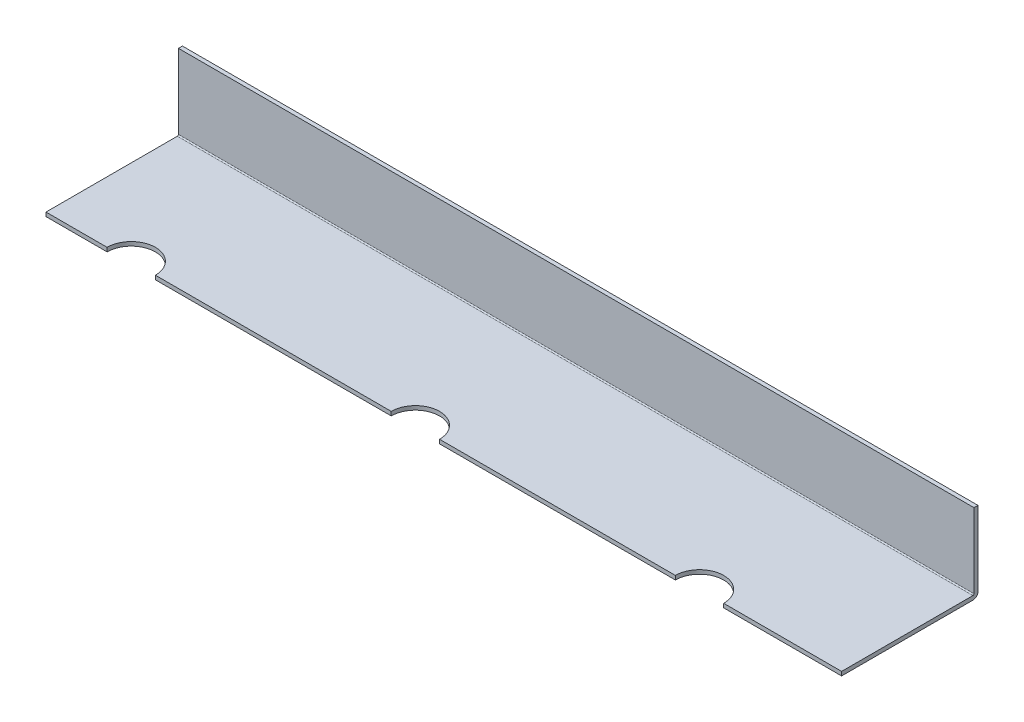
ISO-10303-21;
HEADER;
FILE_DESCRIPTION(('STEP AP214'),'2;1');
FILE_NAME('part.step','',(''),(''),'','','');
FILE_SCHEMA(('AUTOMOTIVE_DESIGN { 1 0 10303 214 1 1 1 1 }'));
ENDSEC;
DATA;
#1=APPLICATION_CONTEXT('core data for automotive mechanical design processes');
#2=APPLICATION_PROTOCOL_DEFINITION('international standard','automotive_design',2000,#1);
#3=PRODUCT_CONTEXT('',#1,'mechanical');
#4=PRODUCT('Part','Part','',(#3));
#5=PRODUCT_RELATED_PRODUCT_CATEGORY('part','',(#4));
#6=PRODUCT_DEFINITION_FORMATION('','',#4);
#7=PRODUCT_DEFINITION_CONTEXT('part definition',#1,'design');
#8=PRODUCT_DEFINITION('design','',#6,#7);
#9=PRODUCT_DEFINITION_SHAPE('','',#8);
#10=(LENGTH_UNIT() NAMED_UNIT(*) SI_UNIT(.MILLI.,.METRE.));
#11=(NAMED_UNIT(*) PLANE_ANGLE_UNIT() SI_UNIT($,.RADIAN.));
#12=(NAMED_UNIT(*) SI_UNIT($,.STERADIAN.) SOLID_ANGLE_UNIT());
#13=UNCERTAINTY_MEASURE_WITH_UNIT(LENGTH_MEASURE(1.E-05),#10,'distance_accuracy_value','');
#14=(GEOMETRIC_REPRESENTATION_CONTEXT(3) GLOBAL_UNCERTAINTY_ASSIGNED_CONTEXT((#13)) GLOBAL_UNIT_ASSIGNED_CONTEXT((#10,
#11,#12)) REPRESENTATION_CONTEXT('',''));
#15=CARTESIAN_POINT('',(0.,0.,0.));
#16=DIRECTION('',(0.,0.,1.));
#17=DIRECTION('',(1.,0.,0.));
#18=AXIS2_PLACEMENT_3D('',#15,#16,#17);
#19=CARTESIAN_POINT('',(-200.,13.31,-47.9999999999996));
#20=DIRECTION('',(0.,0.,-1.));
#21=DIRECTION('',(-1.,0.,0.));
#22=AXIS2_PLACEMENT_3D('',#19,#20,#21);
#23=PLANE('',#22);
#24=DIRECTION('',(-1.,0.,0.));
#25=VECTOR('',#24,1.);
#26=CARTESIAN_POINT('',(0.,-0.7,-47.9999999999996));
#27=LINE('',#26,#25);
#28=CARTESIAN_POINT('',(70.7499999999997,-0.7,-47.9999999999996));
#29=VERTEX_POINT('',#28);
#30=CARTESIAN_POINT('',(29.2499999999997,-0.7,-47.9999999999996));
#31=VERTEX_POINT('',#30);
#32=EDGE_CURVE('E258',#29,#31,#27,.T.);
#33=ORIENTED_EDGE('',*,*,#32,.F.);
#34=DIRECTION('',(0.,1.,0.));
#35=VECTOR('',#34,1.);
#36=CARTESIAN_POINT('',(70.7499999999997,-0.7,-47.9999999999996));
#37=LINE('',#36,#35);
#38=CARTESIAN_POINT('',(70.7499999999997,0.,-47.9999999999996));
#39=VERTEX_POINT('',#38);
#40=EDGE_CURVE('E227',#39,#29,#37,.F.);
#41=ORIENTED_EDGE('',*,*,#40,.F.);
#42=DIRECTION('',(-1.,0.,0.));
#43=VECTOR('',#42,1.);
#44=CARTESIAN_POINT('',(0.,0.,-47.9999999999996));
#45=LINE('',#44,#43);
#46=CARTESIAN_POINT('',(29.2499999999997,0.,-47.9999999999996));
#47=VERTEX_POINT('',#46);
#48=EDGE_CURVE('E255',#39,#47,#45,.T.);
#49=ORIENTED_EDGE('',*,*,#48,.T.);
#50=DIRECTION('',(0.,1.,0.));
#51=VECTOR('',#50,1.);
#52=CARTESIAN_POINT('',(29.2499999999997,-0.7,-47.9999999999996));
#53=LINE('',#52,#51);
#54=EDGE_CURVE('E216',#31,#47,#53,.T.);
#55=ORIENTED_EDGE('',*,*,#54,.F.);
#56=EDGE_LOOP('',(#33,#41,#49,#55));
#57=FACE_BOUND('',#56,.T.);
#58=ADVANCED_FACE('F36',(#57),#23,.F.);
#59=CARTESIAN_POINT('',(120.75,-0.7,-47.9999999999996));
#60=VERTEX_POINT('',#59);
#61=CARTESIAN_POINT('',(79.2499999999997,-0.7,-47.9999999999996));
#62=VERTEX_POINT('',#61);
#63=EDGE_CURVE('E200',#60,#62,#27,.T.);
#64=ORIENTED_EDGE('',*,*,#63,.F.);
#65=DIRECTION('',(0.,1.,0.));
#66=VECTOR('',#65,1.);
#67=CARTESIAN_POINT('',(120.75,-0.7,-47.9999999999996));
#68=LINE('',#67,#66);
#69=CARTESIAN_POINT('',(120.75,0.,-47.9999999999996));
#70=VERTEX_POINT('',#69);
#71=EDGE_CURVE('E223',#70,#60,#68,.F.);
#72=ORIENTED_EDGE('',*,*,#71,.F.);
#73=CARTESIAN_POINT('',(79.2499999999997,0.,-47.9999999999996));
#74=VERTEX_POINT('',#73);
#75=EDGE_CURVE('E201',#70,#74,#45,.T.);
#76=ORIENTED_EDGE('',*,*,#75,.T.);
#77=DIRECTION('',(0.,1.,0.));
#78=VECTOR('',#77,1.);
#79=CARTESIAN_POINT('',(79.2499999999997,-0.7,-47.9999999999996));
#80=LINE('',#79,#78);
#81=EDGE_CURVE('E225',#62,#74,#80,.T.);
#82=ORIENTED_EDGE('',*,*,#81,.F.);
#83=EDGE_LOOP('',(#64,#72,#76,#82));
#84=FACE_BOUND('',#83,.T.);
#85=ADVANCED_FACE('F256',(#84),#23,.F.);
#86=CARTESIAN_POINT('',(9.9999999999999,13.31,-72.));
#87=DIRECTION('',(1.,0.,0.));
#88=DIRECTION('',(0.,0.,-1.));
#89=AXIS2_PLACEMENT_3D('',#86,#87,#88);
#90=PLANE('',#89);
#91=CARTESIAN_POINT('',(9.9999999999999,0.200000000000011,-71.1));
#92=DIRECTION('',(1.,0.,0.));
#93=DIRECTION('',(0.,0.,-1.));
#94=AXIS2_PLACEMENT_3D('',#91,#92,#93);
#95=CIRCLE('',#94,0.900000000000006);
#96=CARTESIAN_POINT('',(9.9999999999999,0.200000000000017,-72.));
#97=VERTEX_POINT('',#96);
#98=CARTESIAN_POINT('',(9.9999999999999,-0.699999999999995,-71.1));
#99=VERTEX_POINT('',#98);
#100=EDGE_CURVE('E170',#97,#99,#95,.F.);
#101=ORIENTED_EDGE('',*,*,#100,.T.);
#102=DIRECTION('',(0.,0.,-1.));
#103=VECTOR('',#102,1.);
#104=CARTESIAN_POINT('',(9.99999999999991,-0.7,0.));
#105=LINE('',#104,#103);
#106=CARTESIAN_POINT('',(9.9999999999999,-0.7,-47.9999999999996));
#107=VERTEX_POINT('',#106);
#108=EDGE_CURVE('E179',#107,#99,#105,.T.);
#109=ORIENTED_EDGE('',*,*,#108,.F.);
#110=DIRECTION('',(0.,-1.,0.));
#111=VECTOR('',#110,1.);
#112=CARTESIAN_POINT('',(9.9999999999999,13.31,-47.9999999999996));
#113=LINE('',#112,#111);
#114=CARTESIAN_POINT('',(9.9999999999999,0.,-47.9999999999996));
#115=VERTEX_POINT('',#114);
#116=EDGE_CURVE('E158',#115,#107,#113,.T.);
#117=ORIENTED_EDGE('',*,*,#116,.F.);
#118=DIRECTION('',(0.,0.,-1.));
#119=VECTOR('',#118,1.);
#120=CARTESIAN_POINT('',(9.99999999999991,0.,0.));
#121=LINE('',#120,#119);
#122=CARTESIAN_POINT('',(9.9999999999999,0.,-71.1));
#123=VERTEX_POINT('',#122);
#124=EDGE_CURVE('E175',#115,#123,#121,.T.);
#125=ORIENTED_EDGE('',*,*,#124,.T.);
#126=CARTESIAN_POINT('',(9.9999999999999,0.200000000000011,-71.1));
#127=DIRECTION('',(1.,0.,0.));
#128=DIRECTION('',(0.,0.,-1.));
#129=AXIS2_PLACEMENT_3D('',#126,#127,#128);
#130=CIRCLE('',#129,0.200000000000006);
#131=CARTESIAN_POINT('',(9.9999999999999,0.200000000000012,-71.3));
#132=VERTEX_POINT('',#131);
#133=EDGE_CURVE('E183',#132,#123,#130,.F.);
#134=ORIENTED_EDGE('',*,*,#133,.F.);
#135=DIRECTION('',(0.,1.,0.));
#136=VECTOR('',#135,1.);
#137=CARTESIAN_POINT('',(9.9999999999999,-2.25383621540445E-13,-71.3));
#138=LINE('',#137,#136);
#139=CARTESIAN_POINT('',(9.9999999999999,13.3,-71.3));
#140=VERTEX_POINT('',#139);
#141=EDGE_CURVE('E157',#132,#140,#138,.T.);
#142=ORIENTED_EDGE('',*,*,#141,.T.);
#143=DIRECTION('',(0.,0.,1.));
#144=VECTOR('',#143,1.);
#145=CARTESIAN_POINT('',(9.9999999999999,13.3,-72.));
#146=LINE('',#145,#144);
#147=CARTESIAN_POINT('',(9.9999999999999,13.3,-72.0000000000001));
#148=VERTEX_POINT('',#147);
#149=EDGE_CURVE('E53',#148,#140,#146,.T.);
#150=ORIENTED_EDGE('',*,*,#149,.F.);
#151=DIRECTION('',(0.,1.,0.));
#152=VECTOR('',#151,1.);
#153=CARTESIAN_POINT('',(9.9999999999999,-2.27827658477636E-13,-72.));
#154=LINE('',#153,#152);
#155=EDGE_CURVE('E61',#97,#148,#154,.T.);
#156=ORIENTED_EDGE('',*,*,#155,.F.);
#157=EDGE_LOOP('',(#101,#109,#117,#125,#134,#142,#150,#156));
#158=FACE_BOUND('',#157,.T.);
#159=ADVANCED_FACE('F288',(#158),#90,.F.);
#160=CARTESIAN_POINT('',(20.7499999999997,0.,-47.9999999999996));
#161=VERTEX_POINT('',#160);
#162=EDGE_CURVE('E178',#161,#115,#45,.T.);
#163=ORIENTED_EDGE('',*,*,#162,.T.);
#164=ORIENTED_EDGE('',*,*,#116,.T.);
#165=CARTESIAN_POINT('',(20.7499999999997,-0.7,-47.9999999999996));
#166=VERTEX_POINT('',#165);
#167=EDGE_CURVE('E182',#166,#107,#27,.T.);
#168=ORIENTED_EDGE('',*,*,#167,.F.);
#169=DIRECTION('',(0.,1.,0.));
#170=VECTOR('',#169,1.);
#171=CARTESIAN_POINT('',(20.7499999999997,-0.7,-47.9999999999996));
#172=LINE('',#171,#170);
#173=EDGE_CURVE('E214',#161,#166,#172,.F.);
#174=ORIENTED_EDGE('',*,*,#173,.F.);
#175=EDGE_LOOP('',(#163,#164,#168,#174));
#176=FACE_BOUND('',#175,.T.);
#177=ADVANCED_FACE('F264',(#176),#23,.F.);
#178=CARTESIAN_POINT('',(150.,0.,-47.9999999999996));
#179=VERTEX_POINT('',#178);
#180=CARTESIAN_POINT('',(129.25,0.,-47.9999999999996));
#181=VERTEX_POINT('',#180);
#182=EDGE_CURVE('E173',#179,#181,#45,.T.);
#183=ORIENTED_EDGE('',*,*,#182,.T.);
#184=DIRECTION('',(0.,1.,0.));
#185=VECTOR('',#184,1.);
#186=CARTESIAN_POINT('',(129.25,-0.7,-47.9999999999996));
#187=LINE('',#186,#185);
#188=CARTESIAN_POINT('',(129.25,-0.7,-47.9999999999996));
#189=VERTEX_POINT('',#188);
#190=EDGE_CURVE('E221',#189,#181,#187,.T.);
#191=ORIENTED_EDGE('',*,*,#190,.F.);
#192=CARTESIAN_POINT('',(150.,-0.7,-47.9999999999996));
#193=VERTEX_POINT('',#192);
#194=EDGE_CURVE('E181',#193,#189,#27,.T.);
#195=ORIENTED_EDGE('',*,*,#194,.F.);
#196=DIRECTION('',(0.,-1.,0.));
#197=VECTOR('',#196,1.);
#198=CARTESIAN_POINT('',(150.,13.31,-47.9999999999996));
#199=LINE('',#198,#197);
#200=EDGE_CURVE('E11',#179,#193,#199,.T.);
#201=ORIENTED_EDGE('',*,*,#200,.F.);
#202=EDGE_LOOP('',(#183,#191,#195,#201));
#203=FACE_BOUND('',#202,.T.);
#204=ADVANCED_FACE('F284',(#203),#23,.F.);
#205=CARTESIAN_POINT('',(150.,13.31,-72.));
#206=DIRECTION('',(1.,0.,0.));
#207=DIRECTION('',(0.,0.,-1.));
#208=AXIS2_PLACEMENT_3D('',#205,#206,#207);
#209=PLANE('',#208);
#210=CARTESIAN_POINT('',(150.,0.200000000000001,-71.1));
#211=DIRECTION('',(1.,0.,0.));
#212=DIRECTION('',(0.,0.,-1.));
#213=AXIS2_PLACEMENT_3D('',#210,#211,#212);
#214=CIRCLE('',#213,0.900000000000006);
#215=CARTESIAN_POINT('',(150.,0.200000000000012,-72.));
#216=VERTEX_POINT('',#215);
#217=CARTESIAN_POINT('',(150.,-0.700000000000005,-71.1));
#218=VERTEX_POINT('',#217);
#219=EDGE_CURVE('E185',#216,#218,#214,.F.);
#220=ORIENTED_EDGE('',*,*,#219,.F.);
#221=DIRECTION('',(0.,1.,0.));
#222=VECTOR('',#221,1.);
#223=CARTESIAN_POINT('',(150.,-2.27827658477636E-13,-72.));
#224=LINE('',#223,#222);
#225=CARTESIAN_POINT('',(150.,13.3,-72.0000000000001));
#226=VERTEX_POINT('',#225);
#227=EDGE_CURVE('E156',#216,#226,#224,.T.);
#228=ORIENTED_EDGE('',*,*,#227,.T.);
#229=DIRECTION('',(0.,0.,1.));
#230=VECTOR('',#229,1.);
#231=CARTESIAN_POINT('',(150.,13.3,-72.0000000000001));
#232=LINE('',#231,#230);
#233=CARTESIAN_POINT('',(150.,13.3,-71.3));
#234=VERTEX_POINT('',#233);
#235=EDGE_CURVE('E40',#226,#234,#232,.T.);
#236=ORIENTED_EDGE('',*,*,#235,.T.);
#237=DIRECTION('',(0.,1.,0.));
#238=VECTOR('',#237,1.);
#239=CARTESIAN_POINT('',(150.,-2.25383621540445E-13,-71.3));
#240=LINE('',#239,#238);
#241=CARTESIAN_POINT('',(150.,0.200000000000007,-71.3));
#242=VERTEX_POINT('',#241);
#243=EDGE_CURVE('E145',#242,#234,#240,.T.);
#244=ORIENTED_EDGE('',*,*,#243,.F.);
#245=CARTESIAN_POINT('',(150.,0.200000000000001,-71.1));
#246=DIRECTION('',(1.,0.,0.));
#247=DIRECTION('',(0.,0.,-1.));
#248=AXIS2_PLACEMENT_3D('',#245,#246,#247);
#249=CIRCLE('',#248,0.200000000000006);
#250=CARTESIAN_POINT('',(150.,0.,-71.1));
#251=VERTEX_POINT('',#250);
#252=EDGE_CURVE('E174',#242,#251,#249,.F.);
#253=ORIENTED_EDGE('',*,*,#252,.T.);
#254=DIRECTION('',(0.,0.,-1.));
#255=VECTOR('',#254,1.);
#256=CARTESIAN_POINT('',(150.,0.,0.));
#257=LINE('',#256,#255);
#258=EDGE_CURVE('E204',#179,#251,#257,.T.);
#259=ORIENTED_EDGE('',*,*,#258,.F.);
#260=ORIENTED_EDGE('',*,*,#200,.T.);
#261=DIRECTION('',(0.,0.,-1.));
#262=VECTOR('',#261,1.);
#263=CARTESIAN_POINT('',(150.,-0.7,0.));
#264=LINE('',#263,#262);
#265=EDGE_CURVE('E197',#193,#218,#264,.T.);
#266=ORIENTED_EDGE('',*,*,#265,.T.);
#267=EDGE_LOOP('',(#220,#228,#236,#244,#253,#259,#260,#266));
#268=FACE_BOUND('',#267,.T.);
#269=ADVANCED_FACE('F154',(#268),#209,.T.);
#270=CARTESIAN_POINT('',(0.,-0.7,0.));
#271=DIRECTION('',(0.,1.,0.));
#272=DIRECTION('',(0.,0.,1.));
#273=AXIS2_PLACEMENT_3D('',#270,#271,#272);
#274=PLANE('',#273);
#275=CARTESIAN_POINT('',(125.,-0.7,-48.0000000000003));
#276=DIRECTION('',(0.,1.,0.));
#277=DIRECTION('',(0.,0.,1.));
#278=AXIS2_PLACEMENT_3D('',#275,#276,#277);
#279=CIRCLE('',#278,4.25);
#280=EDGE_CURVE('E241',#189,#60,#279,.T.);
#281=ORIENTED_EDGE('',*,*,#280,.T.);
#282=ORIENTED_EDGE('',*,*,#63,.T.);
#283=CARTESIAN_POINT('',(74.9999999999997,-0.7,-48.0000000000002));
#284=DIRECTION('',(0.,1.,0.));
#285=DIRECTION('',(0.,0.,-1.));
#286=AXIS2_PLACEMENT_3D('',#283,#284,#285);
#287=CIRCLE('',#286,4.25000000000001);
#288=EDGE_CURVE('E236',#62,#29,#287,.T.);
#289=ORIENTED_EDGE('',*,*,#288,.T.);
#290=ORIENTED_EDGE('',*,*,#32,.T.);
#291=CARTESIAN_POINT('',(24.9999999999997,-0.7,-48.0000000000001));
#292=DIRECTION('',(0.,1.,0.));
#293=DIRECTION('',(0.,0.,1.));
#294=AXIS2_PLACEMENT_3D('',#291,#292,#293);
#295=CIRCLE('',#294,4.25000000000001);
#296=EDGE_CURVE('E188',#31,#166,#295,.T.);
#297=ORIENTED_EDGE('',*,*,#296,.T.);
#298=ORIENTED_EDGE('',*,*,#167,.T.);
#299=ORIENTED_EDGE('',*,*,#108,.T.);
#300=DIRECTION('',(-1.,0.,0.));
#301=VECTOR('',#300,1.);
#302=CARTESIAN_POINT('',(-200.,-0.699999999999981,-71.1));
#303=LINE('',#302,#301);
#304=EDGE_CURVE('E194',#99,#218,#303,.F.);
#305=ORIENTED_EDGE('',*,*,#304,.T.);
#306=ORIENTED_EDGE('',*,*,#265,.F.);
#307=ORIENTED_EDGE('',*,*,#194,.T.);
#308=EDGE_LOOP('',(#281,#282,#289,#290,#297,#298,#299,#305,#306,#307));
#309=FACE_BOUND('',#308,.T.);
#310=ADVANCED_FACE('F263',(#309),#274,.F.);
#311=CARTESIAN_POINT('',(0.,0.,0.));
#312=DIRECTION('',(0.,1.,0.));
#313=DIRECTION('',(0.,0.,1.));
#314=AXIS2_PLACEMENT_3D('',#311,#312,#313);
#315=PLANE('',#314);
#316=ORIENTED_EDGE('',*,*,#75,.F.);
#317=CARTESIAN_POINT('',(125.,0.,-48.0000000000003));
#318=DIRECTION('',(0.,1.,0.));
#319=DIRECTION('',(0.,0.,1.));
#320=AXIS2_PLACEMENT_3D('',#317,#318,#319);
#321=CIRCLE('',#320,4.25);
#322=EDGE_CURVE('E167',#181,#70,#321,.T.);
#323=ORIENTED_EDGE('',*,*,#322,.F.);
#324=ORIENTED_EDGE('',*,*,#182,.F.);
#325=ORIENTED_EDGE('',*,*,#258,.T.);
#326=DIRECTION('',(-1.,0.,0.));
#327=VECTOR('',#326,1.);
#328=CARTESIAN_POINT('',(-200.,0.,-71.1));
#329=LINE('',#328,#327);
#330=EDGE_CURVE('E192',#123,#251,#329,.F.);
#331=ORIENTED_EDGE('',*,*,#330,.F.);
#332=ORIENTED_EDGE('',*,*,#124,.F.);
#333=ORIENTED_EDGE('',*,*,#162,.F.);
#334=CARTESIAN_POINT('',(24.9999999999997,0.,-48.0000000000001));
#335=DIRECTION('',(0.,1.,0.));
#336=DIRECTION('',(0.,0.,1.));
#337=AXIS2_PLACEMENT_3D('',#334,#335,#336);
#338=CIRCLE('',#337,4.25000000000001);
#339=EDGE_CURVE('E233',#47,#161,#338,.T.);
#340=ORIENTED_EDGE('',*,*,#339,.F.);
#341=ORIENTED_EDGE('',*,*,#48,.F.);
#342=CARTESIAN_POINT('',(74.9999999999997,0.,-48.0000000000002));
#343=DIRECTION('',(0.,1.,0.));
#344=DIRECTION('',(0.,0.,-1.));
#345=AXIS2_PLACEMENT_3D('',#342,#343,#344);
#346=CIRCLE('',#345,4.25000000000001);
#347=EDGE_CURVE('E239',#74,#39,#346,.T.);
#348=ORIENTED_EDGE('',*,*,#347,.F.);
#349=EDGE_LOOP('',(#316,#323,#324,#325,#331,#332,#333,#340,#341,#348));
#350=FACE_BOUND('',#349,.T.);
#351=ADVANCED_FACE('F211',(#350),#315,.T.);
#352=CARTESIAN_POINT('',(-200.,0.200000000000025,-71.1));
#353=DIRECTION('',(-1.,0.,0.));
#354=DIRECTION('',(0.,0.,-1.));
#355=AXIS2_PLACEMENT_3D('',#352,#353,#354);
#356=CYLINDRICAL_SURFACE('',#355,0.900000000000006);
#357=ORIENTED_EDGE('',*,*,#100,.F.);
#358=DIRECTION('',(-1.,0.,0.));
#359=VECTOR('',#358,1.);
#360=CARTESIAN_POINT('',(200.,0.200000000000011,-72.));
#361=LINE('',#360,#359);
#362=EDGE_CURVE('E141',#97,#216,#361,.F.);
#363=ORIENTED_EDGE('',*,*,#362,.T.);
#364=ORIENTED_EDGE('',*,*,#219,.T.);
#365=ORIENTED_EDGE('',*,*,#304,.F.);
#366=EDGE_LOOP('',(#357,#363,#364,#365));
#367=FACE_BOUND('',#366,.T.);
#368=ADVANCED_FACE('F302',(#367),#356,.T.);
#369=CARTESIAN_POINT('',(-200.,0.200000000000025,-71.1));
#370=DIRECTION('',(-1.,0.,0.));
#371=DIRECTION('',(0.,0.,-1.));
#372=AXIS2_PLACEMENT_3D('',#369,#370,#371);
#373=CYLINDRICAL_SURFACE('',#372,0.200000000000006);
#374=DIRECTION('',(-1.,0.,0.));
#375=VECTOR('',#374,1.);
#376=CARTESIAN_POINT('',(200.,0.200000000000006,-71.3));
#377=LINE('',#376,#375);
#378=EDGE_CURVE('E45',#242,#132,#377,.T.);
#379=ORIENTED_EDGE('',*,*,#378,.T.);
#380=ORIENTED_EDGE('',*,*,#133,.T.);
#381=ORIENTED_EDGE('',*,*,#330,.T.);
#382=ORIENTED_EDGE('',*,*,#252,.F.);
#383=EDGE_LOOP('',(#379,#380,#381,#382));
#384=FACE_BOUND('',#383,.T.);
#385=ADVANCED_FACE('F206',(#384),#373,.F.);
#386=CARTESIAN_POINT('',(0.,-2.25383621540445E-13,-71.3));
#387=DIRECTION('',(0.,0.,1.));
#388=DIRECTION('',(0.,-1.,0.));
#389=AXIS2_PLACEMENT_3D('',#386,#387,#388);
#390=PLANE('',#389);
#391=ORIENTED_EDGE('',*,*,#141,.F.);
#392=ORIENTED_EDGE('',*,*,#378,.F.);
#393=ORIENTED_EDGE('',*,*,#243,.T.);
#394=DIRECTION('',(-1.,0.,0.));
#395=VECTOR('',#394,1.);
#396=CARTESIAN_POINT('',(200.,13.3,-71.3));
#397=LINE('',#396,#395);
#398=EDGE_CURVE('E137',#140,#234,#397,.F.);
#399=ORIENTED_EDGE('',*,*,#398,.F.);
#400=EDGE_LOOP('',(#391,#392,#393,#399));
#401=FACE_BOUND('',#400,.T.);
#402=ADVANCED_FACE('F146',(#401),#390,.T.);
#403=CARTESIAN_POINT('',(0.,-2.27827658477636E-13,-72.));
#404=DIRECTION('',(0.,0.,1.));
#405=DIRECTION('',(0.,-1.,0.));
#406=AXIS2_PLACEMENT_3D('',#403,#404,#405);
#407=PLANE('',#406);
#408=ORIENTED_EDGE('',*,*,#362,.F.);
#409=ORIENTED_EDGE('',*,*,#155,.T.);
#410=DIRECTION('',(1.,0.,0.));
#411=VECTOR('',#410,1.);
#412=CARTESIAN_POINT('',(0.,13.3,-72.0000000000001));
#413=LINE('',#412,#411);
#414=EDGE_CURVE('E142',#148,#226,#413,.T.);
#415=ORIENTED_EDGE('',*,*,#414,.T.);
#416=ORIENTED_EDGE('',*,*,#227,.F.);
#417=EDGE_LOOP('',(#408,#409,#415,#416));
#418=FACE_BOUND('',#417,.T.);
#419=ADVANCED_FACE('F303',(#418),#407,.F.);
#420=CARTESIAN_POINT('',(200.,13.3,-72.0000000000001));
#421=DIRECTION('',(0.,-1.,0.));
#422=DIRECTION('',(0.,0.,-1.));
#423=AXIS2_PLACEMENT_3D('',#420,#421,#422);
#424=PLANE('',#423);
#425=ORIENTED_EDGE('',*,*,#414,.F.);
#426=ORIENTED_EDGE('',*,*,#149,.T.);
#427=ORIENTED_EDGE('',*,*,#398,.T.);
#428=ORIENTED_EDGE('',*,*,#235,.F.);
#429=EDGE_LOOP('',(#425,#426,#427,#428));
#430=FACE_BOUND('',#429,.T.);
#431=ADVANCED_FACE('F38',(#430),#424,.F.);
#432=CARTESIAN_POINT('',(125.,-0.7,-48.0000000000003));
#433=DIRECTION('',(0.,1.,0.));
#434=DIRECTION('',(0.,0.,1.));
#435=AXIS2_PLACEMENT_3D('',#432,#433,#434);
#436=CYLINDRICAL_SURFACE('',#435,4.25);
#437=ORIENTED_EDGE('',*,*,#322,.T.);
#438=ORIENTED_EDGE('',*,*,#71,.T.);
#439=ORIENTED_EDGE('',*,*,#280,.F.);
#440=ORIENTED_EDGE('',*,*,#190,.T.);
#441=EDGE_LOOP('',(#437,#438,#439,#440));
#442=FACE_BOUND('',#441,.T.);
#443=ADVANCED_FACE('F248',(#442),#436,.F.);
#444=CARTESIAN_POINT('',(74.9999999999997,-0.7,-48.0000000000002));
#445=DIRECTION('',(0.,1.,0.));
#446=DIRECTION('',(0.,0.,1.));
#447=AXIS2_PLACEMENT_3D('',#444,#445,#446);
#448=CYLINDRICAL_SURFACE('',#447,4.25000000000001);
#449=ORIENTED_EDGE('',*,*,#347,.T.);
#450=ORIENTED_EDGE('',*,*,#40,.T.);
#451=ORIENTED_EDGE('',*,*,#288,.F.);
#452=ORIENTED_EDGE('',*,*,#81,.T.);
#453=EDGE_LOOP('',(#449,#450,#451,#452));
#454=FACE_BOUND('',#453,.T.);
#455=ADVANCED_FACE('F273',(#454),#448,.F.);
#456=CARTESIAN_POINT('',(24.9999999999997,-0.7,-48.0000000000001));
#457=DIRECTION('',(0.,1.,0.));
#458=DIRECTION('',(0.,0.,1.));
#459=AXIS2_PLACEMENT_3D('',#456,#457,#458);
#460=CYLINDRICAL_SURFACE('',#459,4.25000000000001);
#461=ORIENTED_EDGE('',*,*,#339,.T.);
#462=ORIENTED_EDGE('',*,*,#173,.T.);
#463=ORIENTED_EDGE('',*,*,#296,.F.);
#464=ORIENTED_EDGE('',*,*,#54,.T.);
#465=EDGE_LOOP('',(#461,#462,#463,#464));
#466=FACE_BOUND('',#465,.T.);
#467=ADVANCED_FACE('F268',(#466),#460,.F.);
#468=CLOSED_SHELL('',(#58,#85,#159,#177,#204,#269,#310,#351,#368,#385,#402,#419,#431,#443,#455,#467));
#469=MANIFOLD_SOLID_BREP('B2',#468);
#470=ADVANCED_BREP_SHAPE_REPRESENTATION('',(#18,#469),#14);
#471=SHAPE_DEFINITION_REPRESENTATION(#9,#470);
ENDSEC;
END-ISO-10303-21;
